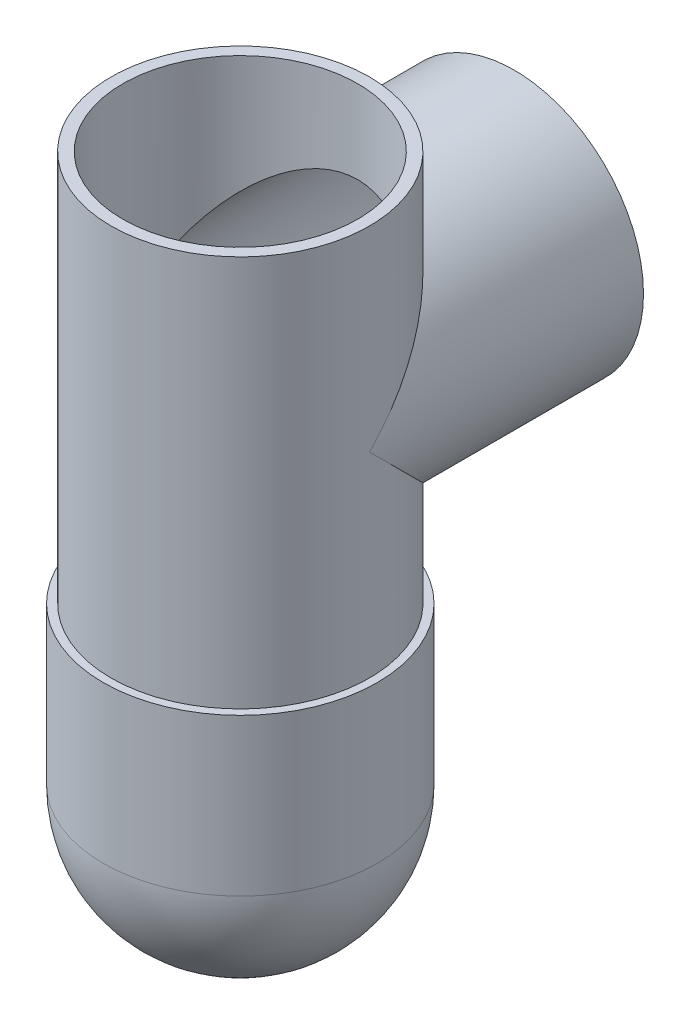
ISO-10303-21;
HEADER;
FILE_DESCRIPTION(('STEP AP214'),'2;1');
FILE_NAME('part.step','',(''),(''),'','','');
FILE_SCHEMA(('AUTOMOTIVE_DESIGN { 1 0 10303 214 1 1 1 1 }'));
ENDSEC;
DATA;
#1=APPLICATION_CONTEXT('core data for automotive mechanical design processes');
#2=APPLICATION_PROTOCOL_DEFINITION('international standard','automotive_design',2000,#1);
#3=PRODUCT_CONTEXT('',#1,'mechanical');
#4=PRODUCT('Part','Part','',(#3));
#5=PRODUCT_RELATED_PRODUCT_CATEGORY('part','',(#4));
#6=PRODUCT_DEFINITION_FORMATION('','',#4);
#7=PRODUCT_DEFINITION_CONTEXT('part definition',#1,'design');
#8=PRODUCT_DEFINITION('design','',#6,#7);
#9=PRODUCT_DEFINITION_SHAPE('','',#8);
#10=(LENGTH_UNIT() NAMED_UNIT(*) SI_UNIT(.MILLI.,.METRE.));
#11=(NAMED_UNIT(*) PLANE_ANGLE_UNIT() SI_UNIT($,.RADIAN.));
#12=(NAMED_UNIT(*) SI_UNIT($,.STERADIAN.) SOLID_ANGLE_UNIT());
#13=UNCERTAINTY_MEASURE_WITH_UNIT(LENGTH_MEASURE(1.E-05),#10,'distance_accuracy_value','');
#14=(GEOMETRIC_REPRESENTATION_CONTEXT(3) GLOBAL_UNCERTAINTY_ASSIGNED_CONTEXT((#13)) GLOBAL_UNIT_ASSIGNED_CONTEXT((#10,
#11,#12)) REPRESENTATION_CONTEXT('',''));
#15=CARTESIAN_POINT('',(0.,0.,0.));
#16=DIRECTION('',(0.,0.,1.));
#17=DIRECTION('',(1.,0.,0.));
#18=AXIS2_PLACEMENT_3D('',#15,#16,#17);
#19=CARTESIAN_POINT('',(0.,-70.,0.));
#20=DIRECTION('',(0.,1.,0.));
#21=DIRECTION('',(0.,0.,1.));
#22=AXIS2_PLACEMENT_3D('',#19,#20,#21);
#23=CYLINDRICAL_SURFACE('',#22,16.5);
#24=CARTESIAN_POINT('',(0.,-50.,0.));
#25=DIRECTION('',(0.,-1.,0.));
#26=DIRECTION('',(0.,0.,-1.));
#27=AXIS2_PLACEMENT_3D('',#24,#25,#26);
#28=CIRCLE('',#27,16.5);
#29=CARTESIAN_POINT('',(0.,-50.,-16.5));
#30=VERTEX_POINT('',#29);
#31=EDGE_CURVE('E150',#30,#30,#28,.T.);
#32=ORIENTED_EDGE('',*,*,#31,.F.);
#33=EDGE_LOOP('',(#32));
#34=FACE_BOUND('',#33,.T.);
#35=CARTESIAN_POINT('',(0.,0.,0.));
#36=DIRECTION('',(0.,1.,0.));
#37=DIRECTION('',(0.,0.,1.));
#38=AXIS2_PLACEMENT_3D('',#35,#36,#37);
#39=CIRCLE('',#38,16.5);
#40=CARTESIAN_POINT('',(0.,0.,16.5));
#41=VERTEX_POINT('',#40);
#42=EDGE_CURVE('E146',#41,#41,#39,.T.);
#43=ORIENTED_EDGE('',*,*,#42,.F.);
#44=EDGE_LOOP('',(#43));
#45=FACE_BOUND('',#44,.T.);
#46=CARTESIAN_POINT('',(0.,-25.,0.));
#47=DIRECTION('',(0.,0.707106781186547,0.707106781186547));
#48=DIRECTION('',(0.,0.707106781186547,-0.707106781186547));
#49=AXIS2_PLACEMENT_3D('',#46,#47,#48);
#50=ELLIPSE('',#49,23.3345237791561,16.5);
#51=CARTESIAN_POINT('',(16.5,-25.,0.));
#52=VERTEX_POINT('',#51);
#53=CARTESIAN_POINT('',(-16.5,-25.,0.));
#54=VERTEX_POINT('',#53);
#55=EDGE_CURVE('E130',#52,#54,#50,.T.);
#56=ORIENTED_EDGE('',*,*,#55,.T.);
#57=CARTESIAN_POINT('',(0.,-25.,0.));
#58=DIRECTION('',(0.,0.707106781186547,-0.707106781186547));
#59=DIRECTION('',(0.,0.707106781186547,0.707106781186547));
#60=AXIS2_PLACEMENT_3D('',#57,#58,#59);
#61=ELLIPSE('',#60,23.3345237791561,16.5);
#62=EDGE_CURVE('E77',#54,#52,#61,.F.);
#63=ORIENTED_EDGE('',*,*,#62,.T.);
#64=EDGE_LOOP('',(#56,#63));
#65=FACE_BOUND('',#64,.T.);
#66=ADVANCED_FACE('F51',(#34,#45,#65),#23,.T.);
#67=CARTESIAN_POINT('',(0.,-50.,0.));
#68=DIRECTION('',(0.,-1.,0.));
#69=DIRECTION('',(0.,0.,-1.));
#70=AXIS2_PLACEMENT_3D('',#67,#68,#69);
#71=CYLINDRICAL_SURFACE('',#70,17.5);
#72=CARTESIAN_POINT('',(0.,-50.,0.));
#73=DIRECTION('',(0.,-1.,0.));
#74=DIRECTION('',(0.,0.,-1.));
#75=AXIS2_PLACEMENT_3D('',#72,#73,#74);
#76=CIRCLE('',#75,17.5);
#77=CARTESIAN_POINT('',(0.,-50.,-17.5));
#78=VERTEX_POINT('',#77);
#79=EDGE_CURVE('E155',#78,#78,#76,.T.);
#80=CARTESIAN_POINT('',(0.,-70.,0.));
#81=DIRECTION('',(0.,-1.,0.));
#82=DIRECTION('',(0.,0.,-1.));
#83=AXIS2_PLACEMENT_3D('',#80,#81,#82);
#84=CIRCLE('',#83,17.5);
#85=CARTESIAN_POINT('',(0.,-70.,-17.5));
#86=VERTEX_POINT('',#85);
#87=EDGE_CURVE('E154',#86,#86,#84,.T.);
#88=CARTESIAN_POINT('',(0.,-50.,-17.5));
#89=CARTESIAN_POINT('',(0.,-50.2083333333333,-17.5));
#90=CARTESIAN_POINT('',(0.,-50.4166666666667,-17.5));
#91=CARTESIAN_POINT('',(0.,-50.8333333333333,-17.5));
#92=CARTESIAN_POINT('',(0.,-51.0416666666667,-17.5));
#93=CARTESIAN_POINT('',(0.,-51.4583333333333,-17.5));
#94=CARTESIAN_POINT('',(0.,-51.6666666666667,-17.5));
#95=CARTESIAN_POINT('',(0.,-52.0833333333333,-17.5));
#96=CARTESIAN_POINT('',(0.,-52.2916666666667,-17.5));
#97=CARTESIAN_POINT('',(0.,-52.7083333333333,-17.5));
#98=CARTESIAN_POINT('',(0.,-52.9166666666667,-17.5));
#99=CARTESIAN_POINT('',(0.,-53.3333333333333,-17.5));
#100=CARTESIAN_POINT('',(0.,-53.5416666666667,-17.5));
#101=CARTESIAN_POINT('',(0.,-53.9583333333333,-17.5));
#102=CARTESIAN_POINT('',(0.,-54.1666666666667,-17.5));
#103=CARTESIAN_POINT('',(0.,-54.5833333333333,-17.5));
#104=CARTESIAN_POINT('',(0.,-54.7916666666667,-17.5));
#105=CARTESIAN_POINT('',(0.,-55.2083333333333,-17.5));
#106=CARTESIAN_POINT('',(0.,-55.4166666666667,-17.5));
#107=CARTESIAN_POINT('',(0.,-55.8333333333333,-17.5));
#108=CARTESIAN_POINT('',(0.,-56.0416666666667,-17.5));
#109=CARTESIAN_POINT('',(0.,-56.4583333333333,-17.5));
#110=CARTESIAN_POINT('',(0.,-56.6666666666667,-17.5));
#111=CARTESIAN_POINT('',(0.,-57.0833333333333,-17.5));
#112=CARTESIAN_POINT('',(0.,-57.2916666666667,-17.5));
#113=CARTESIAN_POINT('',(0.,-57.7083333333333,-17.5));
#114=CARTESIAN_POINT('',(0.,-57.9166666666667,-17.5));
#115=CARTESIAN_POINT('',(0.,-58.3333333333333,-17.5));
#116=CARTESIAN_POINT('',(0.,-58.5416666666667,-17.5));
#117=CARTESIAN_POINT('',(0.,-58.9583333333333,-17.5));
#118=CARTESIAN_POINT('',(0.,-59.1666666666667,-17.5));
#119=CARTESIAN_POINT('',(0.,-59.5833333333333,-17.5));
#120=CARTESIAN_POINT('',(0.,-59.7916666666667,-17.5));
#121=CARTESIAN_POINT('',(0.,-60.2083333333333,-17.5));
#122=CARTESIAN_POINT('',(0.,-60.4166666666667,-17.5));
#123=CARTESIAN_POINT('',(0.,-60.8333333333333,-17.5));
#124=CARTESIAN_POINT('',(0.,-61.0416666666667,-17.5));
#125=CARTESIAN_POINT('',(0.,-61.4583333333333,-17.5));
#126=CARTESIAN_POINT('',(0.,-61.6666666666667,-17.5));
#127=CARTESIAN_POINT('',(0.,-62.0833333333333,-17.5));
#128=CARTESIAN_POINT('',(0.,-62.2916666666667,-17.5));
#129=CARTESIAN_POINT('',(0.,-62.7083333333333,-17.5));
#130=CARTESIAN_POINT('',(0.,-62.9166666666667,-17.5));
#131=CARTESIAN_POINT('',(0.,-63.3333333333333,-17.5));
#132=CARTESIAN_POINT('',(0.,-63.5416666666667,-17.5));
#133=CARTESIAN_POINT('',(0.,-63.9583333333333,-17.5));
#134=CARTESIAN_POINT('',(0.,-64.1666666666667,-17.5));
#135=CARTESIAN_POINT('',(0.,-64.5833333333333,-17.5));
#136=CARTESIAN_POINT('',(0.,-64.7916666666667,-17.5));
#137=CARTESIAN_POINT('',(0.,-65.2083333333333,-17.5));
#138=CARTESIAN_POINT('',(0.,-65.4166666666667,-17.5));
#139=CARTESIAN_POINT('',(0.,-65.8333333333333,-17.5));
#140=CARTESIAN_POINT('',(0.,-66.0416666666667,-17.5));
#141=CARTESIAN_POINT('',(0.,-66.4583333333333,-17.5));
#142=CARTESIAN_POINT('',(0.,-66.6666666666667,-17.5));
#143=CARTESIAN_POINT('',(0.,-67.0833333333333,-17.5));
#144=CARTESIAN_POINT('',(0.,-67.2916666666667,-17.5));
#145=CARTESIAN_POINT('',(0.,-67.7083333333333,-17.5));
#146=CARTESIAN_POINT('',(0.,-67.9166666666667,-17.5));
#147=CARTESIAN_POINT('',(0.,-68.3333333333333,-17.5));
#148=CARTESIAN_POINT('',(0.,-68.5416666666667,-17.5));
#149=CARTESIAN_POINT('',(0.,-68.9583333333333,-17.5));
#150=CARTESIAN_POINT('',(0.,-69.1666666666667,-17.5));
#151=CARTESIAN_POINT('',(0.,-69.5833333333333,-17.5));
#152=CARTESIAN_POINT('',(0.,-69.7916666666667,-17.5));
#153=CARTESIAN_POINT('',(0.,-70.,-17.5));
#154=B_SPLINE_CURVE_WITH_KNOTS('',3,(#88,#89,#90,#91,#92,#93,#94,#95,#96,#97,#98,#99,#100,#101,
#102,#103,#104,#105,#106,#107,#108,#109,#110,#111,#112,#113,#114,#115,#116,#117,#118,#119,#120,
#121,#122,#123,#124,#125,#126,#127,#128,#129,#130,#131,#132,#133,#134,#135,#136,#137,#138,#139,
#140,#141,#142,#143,#144,#145,#146,#147,#148,#149,#150,#151,#152,#153),.UNSPECIFIED.,.F.,.F.,(4,
2,2,2,2,2,2,2,2,2,2,2,2,2,2,2,2,2,2,2,2,2,2,2,2,2,2,2,2,2,2,2,4),(0.,0.624999999999994,
1.24999999999999,1.87499999999999,2.5,3.125,3.75,4.375,5.,5.625,6.25,6.87499999999999,
7.49999999999999,8.12499999999999,8.74999999999999,9.37499999999999,9.99999999999999,10.625,
11.25,11.875,12.5,13.125,13.75,14.375,15.,15.625,16.25,16.875,17.5,18.125,18.75,19.375,20.),.UNSPECIFIED.);
#155=EDGE_CURVE('BSEAM197',#78,#86,#154,.T.);
#156=ORIENTED_EDGE('',*,*,#79,.T.);
#157=ORIENTED_EDGE('',*,*,#87,.F.);
#158=ORIENTED_EDGE('',*,*,#155,.T.);
#159=ORIENTED_EDGE('',*,*,#155,.F.);
#160=EDGE_LOOP('',(#156,#158,#157,#159));
#161=FACE_BOUND('',#160,.T.);
#162=ADVANCED_FACE('F197',(#161),#71,.T.);
#163=CARTESIAN_POINT('',(0.,-50.,0.));
#164=DIRECTION('',(0.,-1.,0.));
#165=DIRECTION('',(0.,0.,-1.));
#166=AXIS2_PLACEMENT_3D('',#163,#164,#165);
#167=PLANE('',#166);
#168=ORIENTED_EDGE('',*,*,#31,.T.);
#169=EDGE_LOOP('',(#168));
#170=FACE_BOUND('',#169,.T.);
#171=ORIENTED_EDGE('',*,*,#79,.F.);
#172=EDGE_LOOP('',(#171));
#173=FACE_BOUND('',#172,.T.);
#174=ADVANCED_FACE('F204',(#170,#173),#167,.F.);
#175=CARTESIAN_POINT('',(0.,0.,0.));
#176=DIRECTION('',(0.,1.,0.));
#177=DIRECTION('',(0.,0.,1.));
#178=AXIS2_PLACEMENT_3D('',#175,#176,#177);
#179=PLANE('',#178);
#180=CARTESIAN_POINT('',(0.,0.,0.));
#181=DIRECTION('',(0.,1.,0.));
#182=DIRECTION('',(0.,0.,1.));
#183=AXIS2_PLACEMENT_3D('',#180,#181,#182);
#184=CIRCLE('',#183,15.);
#185=CARTESIAN_POINT('',(0.,0.,15.));
#186=VERTEX_POINT('',#185);
#187=EDGE_CURVE('E142',#186,#186,#184,.T.);
#188=ORIENTED_EDGE('',*,*,#187,.F.);
#189=EDGE_LOOP('',(#188));
#190=FACE_BOUND('',#189,.T.);
#191=ORIENTED_EDGE('',*,*,#42,.T.);
#192=EDGE_LOOP('',(#191));
#193=FACE_BOUND('',#192,.T.);
#194=ADVANCED_FACE('F53',(#190,#193),#179,.T.);
#195=CARTESIAN_POINT('',(0.,-70.,0.));
#196=DIRECTION('',(0.,1.,0.));
#197=DIRECTION('',(0.,0.,1.));
#198=AXIS2_PLACEMENT_3D('',#195,#196,#197);
#199=CYLINDRICAL_SURFACE('',#198,15.);
#200=CARTESIAN_POINT('',(0.,-25.6113753468674,0.));
#201=DIRECTION('',(0.,-0.707106781186547,-0.707106781186547));
#202=DIRECTION('',(0.,0.707106781186547,-0.707106781186547));
#203=AXIS2_PLACEMENT_3D('',#200,#201,#202);
#204=ELLIPSE('',#203,21.2132034355964,15.);
#205=CARTESIAN_POINT('',(15.,-25.6113753468674,0.));
#206=VERTEX_POINT('',#205);
#207=CARTESIAN_POINT('',(-15.,-25.6113753468674,0.));
#208=VERTEX_POINT('',#207);
#209=EDGE_CURVE('E96',#206,#208,#204,.F.);
#210=ORIENTED_EDGE('',*,*,#209,.F.);
#211=CARTESIAN_POINT('',(0.,-25.6113753468674,0.));
#212=DIRECTION('',(0.,0.707106781186547,-0.707106781186547));
#213=DIRECTION('',(0.,0.707106781186547,0.707106781186547));
#214=AXIS2_PLACEMENT_3D('',#211,#212,#213);
#215=ELLIPSE('',#214,21.2132034355964,15.);
#216=CARTESIAN_POINT('',(14.8660687473185,-23.6113753468674,2.00000000000001));
#217=VERTEX_POINT('',#216);
#218=EDGE_CURVE('E101',#206,#217,#215,.F.);
#219=ORIENTED_EDGE('',*,*,#218,.T.);
#220=DIRECTION('',(0.,1.,0.));
#221=VECTOR('',#220,1.);
#222=CARTESIAN_POINT('',(14.8660687473185,-70.,2.00000000000001));
#223=LINE('',#222,#221);
#224=CARTESIAN_POINT('',(14.8660687473185,-27.6113753468674,2.00000000000001));
#225=VERTEX_POINT('',#224);
#226=EDGE_CURVE('E60',#225,#217,#223,.T.);
#227=ORIENTED_EDGE('',*,*,#226,.F.);
#228=CARTESIAN_POINT('',(0.,-25.6113753468674,0.));
#229=DIRECTION('',(0.,0.707106781186547,0.707106781186547));
#230=DIRECTION('',(0.,0.707106781186547,-0.707106781186547));
#231=AXIS2_PLACEMENT_3D('',#228,#229,#230);
#232=ELLIPSE('',#231,21.2132034355964,15.);
#233=EDGE_CURVE('E113',#225,#206,#232,.T.);
#234=ORIENTED_EDGE('',*,*,#233,.T.);
#235=CARTESIAN_POINT('',(0.,-25.6113753468674,0.));
#236=DIRECTION('',(0.,0.707106781186547,-0.707106781186547));
#237=DIRECTION('',(0.,-0.707106781186547,-0.707106781186547));
#238=AXIS2_PLACEMENT_3D('',#235,#236,#237);
#239=ELLIPSE('',#238,21.2132034355964,15.);
#240=EDGE_CURVE('E67',#208,#206,#239,.F.);
#241=ORIENTED_EDGE('',*,*,#240,.F.);
#242=CARTESIAN_POINT('',(-14.8660687473185,-27.6113753468674,2.00000000000001));
#243=VERTEX_POINT('',#242);
#244=EDGE_CURVE('E118',#208,#243,#232,.T.);
#245=ORIENTED_EDGE('',*,*,#244,.T.);
#246=DIRECTION('',(0.,1.,0.));
#247=VECTOR('',#246,1.);
#248=CARTESIAN_POINT('',(-14.8660687473185,-70.,2.00000000000001));
#249=LINE('',#248,#247);
#250=CARTESIAN_POINT('',(-14.8660687473185,-23.6113753468674,2.00000000000001));
#251=VERTEX_POINT('',#250);
#252=EDGE_CURVE('E11',#251,#243,#249,.F.);
#253=ORIENTED_EDGE('',*,*,#252,.F.);
#254=EDGE_CURVE('E103',#251,#208,#215,.F.);
#255=ORIENTED_EDGE('',*,*,#254,.T.);
#256=EDGE_LOOP('',(#210,#219,#227,#234,#241,#245,#253,#255));
#257=FACE_BOUND('',#256,.T.);
#258=ORIENTED_EDGE('',*,*,#187,.T.);
#259=EDGE_LOOP('',(#258));
#260=FACE_BOUND('',#259,.T.);
#261=CARTESIAN_POINT('',(0.,-70.,0.));
#262=DIRECTION('',(0.,-1.,0.));
#263=DIRECTION('',(0.,0.,-1.));
#264=AXIS2_PLACEMENT_3D('',#261,#262,#263);
#265=CIRCLE('',#264,15.);
#266=CARTESIAN_POINT('',(0.,-70.0000000000001,-15.));
#267=VERTEX_POINT('',#266);
#268=EDGE_CURVE('E138',#267,#267,#265,.T.);
#269=ORIENTED_EDGE('',*,*,#268,.T.);
#270=EDGE_LOOP('',(#269));
#271=FACE_BOUND('',#270,.T.);
#272=ADVANCED_FACE('F97',(#257,#260,#271),#199,.F.);
#273=CARTESIAN_POINT('',(0.,-70.,0.));
#274=DIRECTION('',(1.,0.,0.));
#275=DIRECTION('',(0.,0.,1.));
#276=AXIS2_PLACEMENT_3D('',#273,#274,#275);
#277=SPHERICAL_SURFACE('',#276,17.5);
#278=CARTESIAN_POINT('',(0.,-70.,0.));
#279=DIRECTION('',(0.,-1.,0.));
#280=DIRECTION('',(0.,0.,-1.));
#281=AXIS2_PLACEMENT_3D('',#278,#279,#280);
#282=SPHERICAL_SURFACE('',#281,17.5);
#283=ORIENTED_EDGE('',*,*,#87,.T.);
#284=EDGE_LOOP('',(#283));
#285=FACE_BOUND('',#284,.T.);
#286=ADVANCED_FACE('F193',(#285),#282,.T.);
#287=CARTESIAN_POINT('',(0.,-70.,0.));
#288=DIRECTION('',(-1.,0.,0.));
#289=DIRECTION('',(0.,1.,0.));
#290=AXIS2_PLACEMENT_3D('',#287,#288,#289);
#291=SPHERICAL_SURFACE('',#290,15.);
#292=CARTESIAN_POINT('',(0.,-70.,0.));
#293=DIRECTION('',(0.,-1.,0.));
#294=DIRECTION('',(0.,0.,-1.));
#295=AXIS2_PLACEMENT_3D('',#292,#293,#294);
#296=SPHERICAL_SURFACE('',#295,15.);
#297=ORIENTED_EDGE('',*,*,#268,.F.);
#298=EDGE_LOOP('',(#297));
#299=FACE_BOUND('',#298,.T.);
#300=ADVANCED_FACE('F187',(#299),#296,.F.);
#301=CARTESIAN_POINT('',(0.,-25.,0.));
#302=DIRECTION('',(0.,0.,-1.));
#303=DIRECTION('',(-1.,0.,0.));
#304=AXIS2_PLACEMENT_3D('',#301,#302,#303);
#305=CYLINDRICAL_SURFACE('',#304,16.5);
#306=ORIENTED_EDGE('',*,*,#62,.F.);
#307=ORIENTED_EDGE('',*,*,#55,.F.);
#308=EDGE_LOOP('',(#306,#307));
#309=FACE_BOUND('',#308,.T.);
#310=CARTESIAN_POINT('',(0.,-25.,-35.));
#311=DIRECTION('',(0.,0.,1.));
#312=DIRECTION('',(1.,0.,0.));
#313=AXIS2_PLACEMENT_3D('',#310,#311,#312);
#314=CIRCLE('',#313,16.5);
#315=CARTESIAN_POINT('',(16.5,-25.,-35.));
#316=VERTEX_POINT('',#315);
#317=EDGE_CURVE('E123',#316,#316,#314,.T.);
#318=ORIENTED_EDGE('',*,*,#317,.T.);
#319=EDGE_LOOP('',(#318));
#320=FACE_BOUND('',#319,.T.);
#321=ADVANCED_FACE('F182',(#309,#320),#305,.T.);
#322=CARTESIAN_POINT('',(0.,-25.,-35.));
#323=DIRECTION('',(0.,0.,1.));
#324=DIRECTION('',(1.,0.,0.));
#325=AXIS2_PLACEMENT_3D('',#322,#323,#324);
#326=PLANE('',#325);
#327=CARTESIAN_POINT('',(0.,-25.6113753468674,-35.));
#328=DIRECTION('',(0.,0.,-1.));
#329=DIRECTION('',(-1.,0.,0.));
#330=AXIS2_PLACEMENT_3D('',#327,#328,#329);
#331=CIRCLE('',#330,15.);
#332=CARTESIAN_POINT('',(-15.,-25.6113753468674,-35.));
#333=VERTEX_POINT('',#332);
#334=EDGE_CURVE('E111',#333,#333,#331,.T.);
#335=ORIENTED_EDGE('',*,*,#334,.F.);
#336=EDGE_LOOP('',(#335));
#337=FACE_BOUND('',#336,.T.);
#338=ORIENTED_EDGE('',*,*,#317,.F.);
#339=EDGE_LOOP('',(#338));
#340=FACE_BOUND('',#339,.T.);
#341=ADVANCED_FACE('F179',(#337,#340),#326,.F.);
#342=CARTESIAN_POINT('',(0.,-25.6113753468674,2.00000000000001));
#343=DIRECTION('',(0.,0.,-1.));
#344=DIRECTION('',(-1.,0.,0.));
#345=AXIS2_PLACEMENT_3D('',#342,#343,#344);
#346=CYLINDRICAL_SURFACE('',#345,15.);
#347=ORIENTED_EDGE('',*,*,#209,.T.);
#348=ORIENTED_EDGE('',*,*,#240,.T.);
#349=EDGE_LOOP('',(#347,#348));
#350=FACE_BOUND('',#349,.T.);
#351=ORIENTED_EDGE('',*,*,#334,.T.);
#352=EDGE_LOOP('',(#351));
#353=FACE_BOUND('',#352,.T.);
#354=ADVANCED_FACE('F108',(#350,#353),#346,.F.);
#355=CARTESIAN_POINT('',(0.,-25.6113753468674,2.00000000000001));
#356=DIRECTION('',(0.,0.,-1.));
#357=DIRECTION('',(-1.,0.,0.));
#358=AXIS2_PLACEMENT_3D('',#355,#356,#357);
#359=PLANE('',#358);
#360=ORIENTED_EDGE('',*,*,#226,.T.);
#361=CARTESIAN_POINT('',(0.,-25.6113753468674,2.00000000000001));
#362=DIRECTION('',(0.,0.,-1.));
#363=DIRECTION('',(-1.,0.,0.));
#364=AXIS2_PLACEMENT_3D('',#361,#362,#363);
#365=CIRCLE('',#364,15.);
#366=EDGE_CURVE('E119',#217,#225,#365,.T.);
#367=ORIENTED_EDGE('',*,*,#366,.T.);
#368=EDGE_LOOP('',(#360,#367));
#369=FACE_BOUND('',#368,.T.);
#370=ADVANCED_FACE('F165',(#369),#359,.T.);
#371=ORIENTED_EDGE('',*,*,#233,.F.);
#372=ORIENTED_EDGE('',*,*,#366,.F.);
#373=ORIENTED_EDGE('',*,*,#218,.F.);
#374=EDGE_LOOP('',(#371,#372,#373));
#375=FACE_BOUND('',#374,.T.);
#376=ADVANCED_FACE('F121',(#375),#346,.F.);
#377=ORIENTED_EDGE('',*,*,#252,.T.);
#378=EDGE_CURVE('E167',#243,#251,#365,.T.);
#379=ORIENTED_EDGE('',*,*,#378,.T.);
#380=EDGE_LOOP('',(#377,#379));
#381=FACE_BOUND('',#380,.T.);
#382=ADVANCED_FACE('F252',(#381),#359,.T.);
#383=ORIENTED_EDGE('',*,*,#378,.F.);
#384=ORIENTED_EDGE('',*,*,#244,.F.);
#385=ORIENTED_EDGE('',*,*,#254,.F.);
#386=EDGE_LOOP('',(#383,#384,#385));
#387=FACE_BOUND('',#386,.T.);
#388=ADVANCED_FACE('F260',(#387),#346,.F.);
#389=CLOSED_SHELL('',(#66,#162,#174,#194,#272,#286,#300,#321,#341,#354,#370,#376,#382,#388));
#390=MANIFOLD_SOLID_BREP('B2',#389);
#391=ADVANCED_BREP_SHAPE_REPRESENTATION('',(#18,#390),#14);
#392=SHAPE_DEFINITION_REPRESENTATION(#9,#391);
ENDSEC;
END-ISO-10303-21;
